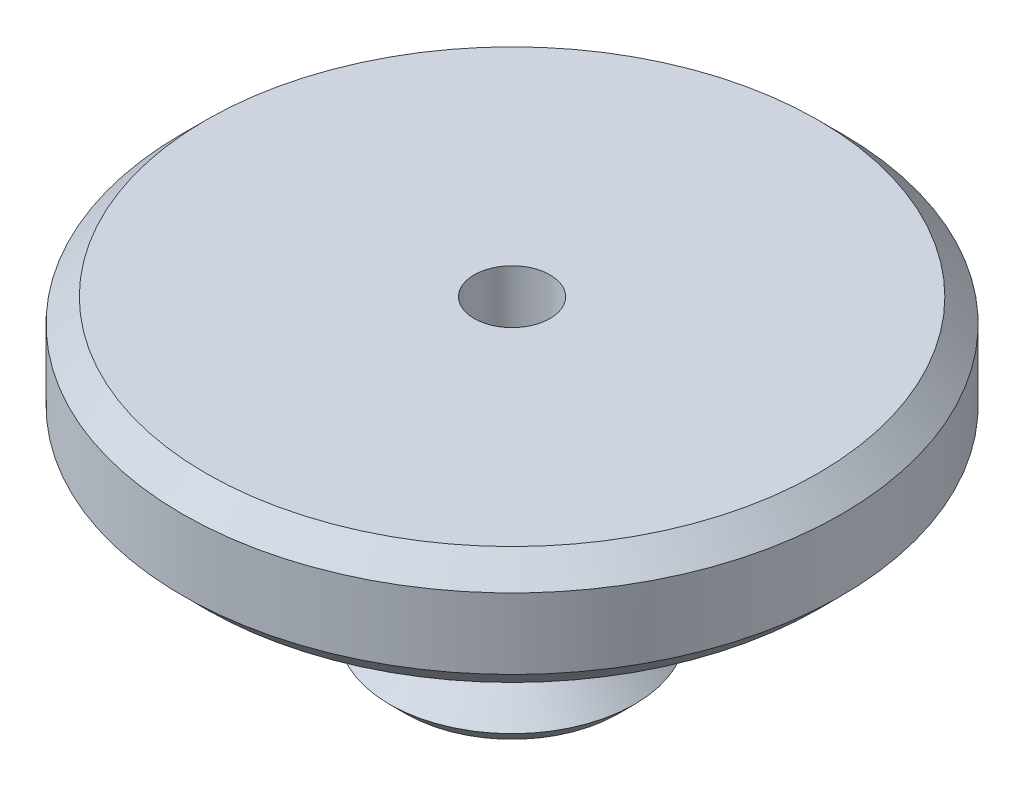
ISO-10303-21;
HEADER;
FILE_DESCRIPTION(('STEP AP214'),'2;1');
FILE_NAME('part.step','',(''),(''),'','','');
FILE_SCHEMA(('AUTOMOTIVE_DESIGN { 1 0 10303 214 1 1 1 1 }'));
ENDSEC;
DATA;
#1=APPLICATION_CONTEXT('core data for automotive mechanical design processes');
#2=APPLICATION_PROTOCOL_DEFINITION('international standard','automotive_design',2000,#1);
#3=PRODUCT_CONTEXT('',#1,'mechanical');
#4=PRODUCT('Part','Part','',(#3));
#5=PRODUCT_RELATED_PRODUCT_CATEGORY('part','',(#4));
#6=PRODUCT_DEFINITION_FORMATION('','',#4);
#7=PRODUCT_DEFINITION_CONTEXT('part definition',#1,'design');
#8=PRODUCT_DEFINITION('design','',#6,#7);
#9=PRODUCT_DEFINITION_SHAPE('','',#8);
#10=(LENGTH_UNIT() NAMED_UNIT(*) SI_UNIT(.MILLI.,.METRE.));
#11=(NAMED_UNIT(*) PLANE_ANGLE_UNIT() SI_UNIT($,.RADIAN.));
#12=(NAMED_UNIT(*) SI_UNIT($,.STERADIAN.) SOLID_ANGLE_UNIT());
#13=UNCERTAINTY_MEASURE_WITH_UNIT(LENGTH_MEASURE(1.E-05),#10,'distance_accuracy_value','');
#14=(GEOMETRIC_REPRESENTATION_CONTEXT(3) GLOBAL_UNCERTAINTY_ASSIGNED_CONTEXT((#13)) GLOBAL_UNIT_ASSIGNED_CONTEXT((#10,
#11,#12)) REPRESENTATION_CONTEXT('',''));
#15=CARTESIAN_POINT('',(0.,0.,0.));
#16=DIRECTION('',(0.,0.,1.));
#17=DIRECTION('',(1.,0.,0.));
#18=AXIS2_PLACEMENT_3D('',#15,#16,#17);
#19=CARTESIAN_POINT('',(0.,0.,0.));
#20=DIRECTION('',(0.,1.,0.));
#21=DIRECTION('',(0.,0.,1.));
#22=AXIS2_PLACEMENT_3D('',#19,#20,#21);
#23=PLANE('',#22);
#24=CARTESIAN_POINT('',(0.,0.,0.));
#25=DIRECTION('',(0.,1.,0.));
#26=DIRECTION('',(0.,0.,1.));
#27=AXIS2_PLACEMENT_3D('',#24,#25,#26);
#28=CIRCLE('',#27,13.);
#29=CARTESIAN_POINT('',(0.,0.,13.));
#30=VERTEX_POINT('',#29);
#31=EDGE_CURVE('E10',#30,#30,#28,.T.);
#32=ORIENTED_EDGE('',*,*,#31,.T.);
#33=EDGE_LOOP('',(#32));
#34=FACE_BOUND('',#33,.T.);
#35=CARTESIAN_POINT('',(0.,0.,0.));
#36=DIRECTION('',(0.,1.,0.));
#37=DIRECTION('',(0.,0.,1.));
#38=AXIS2_PLACEMENT_3D('',#35,#36,#37);
#39=CIRCLE('',#38,1.61);
#40=CARTESIAN_POINT('',(0.,0.,1.61));
#41=VERTEX_POINT('',#40);
#42=EDGE_CURVE('E84',#41,#41,#39,.T.);
#43=ORIENTED_EDGE('',*,*,#42,.F.);
#44=EDGE_LOOP('',(#43));
#45=FACE_BOUND('',#44,.T.);
#46=ADVANCED_FACE('F34',(#34,#45),#23,.T.);
#47=CARTESIAN_POINT('',(0.,-10.,0.));
#48=DIRECTION('',(0.,-1.,0.));
#49=DIRECTION('',(0.,0.,-1.));
#50=AXIS2_PLACEMENT_3D('',#47,#48,#49);
#51=CYLINDRICAL_SURFACE('',#50,14.);
#52=CARTESIAN_POINT('',(0.,-4.00000000000001,0.));
#53=DIRECTION('',(0.,-1.,0.));
#54=DIRECTION('',(0.,0.,-1.));
#55=AXIS2_PLACEMENT_3D('',#52,#53,#54);
#56=CIRCLE('',#55,14.);
#57=CARTESIAN_POINT('',(0.,-4.00000000000001,-14.));
#58=VERTEX_POINT('',#57);
#59=EDGE_CURVE('E41',#58,#58,#56,.F.);
#60=ORIENTED_EDGE('',*,*,#59,.T.);
#61=EDGE_LOOP('',(#60));
#62=FACE_BOUND('',#61,.T.);
#63=CARTESIAN_POINT('',(0.,-0.999999999999994,0.));
#64=DIRECTION('',(0.,1.,0.));
#65=DIRECTION('',(0.,0.,1.));
#66=AXIS2_PLACEMENT_3D('',#63,#64,#65);
#67=CIRCLE('',#66,14.);
#68=CARTESIAN_POINT('',(0.,-0.999999999999994,14.));
#69=VERTEX_POINT('',#68);
#70=EDGE_CURVE('E45',#69,#69,#67,.F.);
#71=ORIENTED_EDGE('',*,*,#70,.T.);
#72=EDGE_LOOP('',(#71));
#73=FACE_BOUND('',#72,.T.);
#74=ADVANCED_FACE('F91',(#62,#73),#51,.T.);
#75=CARTESIAN_POINT('',(14.,-5.,0.));
#76=DIRECTION('',(0.,-1.,0.));
#77=DIRECTION('',(0.,0.,-1.));
#78=AXIS2_PLACEMENT_3D('',#75,#76,#77);
#79=PLANE('',#78);
#80=CARTESIAN_POINT('',(0.,-5.,0.));
#81=DIRECTION('',(0.,-1.,0.));
#82=DIRECTION('',(0.,0.,-1.));
#83=AXIS2_PLACEMENT_3D('',#80,#81,#82);
#84=CIRCLE('',#83,13.);
#85=CARTESIAN_POINT('',(0.,-5.,-13.));
#86=VERTEX_POINT('',#85);
#87=EDGE_CURVE('E49',#86,#86,#84,.T.);
#88=ORIENTED_EDGE('',*,*,#87,.T.);
#89=EDGE_LOOP('',(#88));
#90=FACE_BOUND('',#89,.T.);
#91=CARTESIAN_POINT('',(0.,-5.,0.));
#92=DIRECTION('',(0.,-1.,0.));
#93=DIRECTION('',(0.,0.,-1.));
#94=AXIS2_PLACEMENT_3D('',#91,#92,#93);
#95=CIRCLE('',#94,5.);
#96=CARTESIAN_POINT('',(0.,-5.,-5.00000000000001));
#97=VERTEX_POINT('',#96);
#98=EDGE_CURVE('E60',#97,#97,#95,.T.);
#99=ORIENTED_EDGE('',*,*,#98,.F.);
#100=EDGE_LOOP('',(#99));
#101=FACE_BOUND('',#100,.T.);
#102=ADVANCED_FACE('F96',(#90,#101),#79,.T.);
#103=CARTESIAN_POINT('',(0.,-10.,0.));
#104=DIRECTION('',(0.,-1.,0.));
#105=DIRECTION('',(0.,0.,-1.));
#106=AXIS2_PLACEMENT_3D('',#103,#104,#105);
#107=CYLINDRICAL_SURFACE('',#106,5.);
#108=ORIENTED_EDGE('',*,*,#98,.T.);
#109=EDGE_LOOP('',(#108));
#110=FACE_BOUND('',#109,.T.);
#111=CARTESIAN_POINT('',(0.,-10.,0.));
#112=DIRECTION('',(0.,-1.,0.));
#113=DIRECTION('',(0.,0.,-1.));
#114=AXIS2_PLACEMENT_3D('',#111,#112,#113);
#115=CIRCLE('',#114,5.);
#116=CARTESIAN_POINT('',(0.,-10.,-5.00000000000001));
#117=VERTEX_POINT('',#116);
#118=EDGE_CURVE('E63',#117,#117,#115,.T.);
#119=ORIENTED_EDGE('',*,*,#118,.F.);
#120=EDGE_LOOP('',(#119));
#121=FACE_BOUND('',#120,.T.);
#122=ADVANCED_FACE('F115',(#110,#121),#107,.T.);
#123=CARTESIAN_POINT('',(5.00000000000001,-10.,0.));
#124=DIRECTION('',(0.,-1.,0.));
#125=DIRECTION('',(0.,0.,-1.));
#126=AXIS2_PLACEMENT_3D('',#123,#124,#125);
#127=PLANE('',#126);
#128=ORIENTED_EDGE('',*,*,#118,.T.);
#129=EDGE_LOOP('',(#128));
#130=FACE_BOUND('',#129,.T.);
#131=CARTESIAN_POINT('',(0.,-10.,0.));
#132=DIRECTION('',(0.,-1.,0.));
#133=DIRECTION('',(0.,0.,-1.));
#134=AXIS2_PLACEMENT_3D('',#131,#132,#133);
#135=CIRCLE('',#134,4.);
#136=CARTESIAN_POINT('',(0.,-10.,-4.00000000000001));
#137=VERTEX_POINT('',#136);
#138=EDGE_CURVE('E66',#137,#137,#135,.T.);
#139=ORIENTED_EDGE('',*,*,#138,.F.);
#140=EDGE_LOOP('',(#139));
#141=FACE_BOUND('',#140,.T.);
#142=ADVANCED_FACE('F120',(#130,#141),#127,.T.);
#143=CARTESIAN_POINT('',(0.,-10.,0.));
#144=DIRECTION('',(0.,-1.,0.));
#145=DIRECTION('',(0.,0.,-1.));
#146=AXIS2_PLACEMENT_3D('',#143,#144,#145);
#147=CYLINDRICAL_SURFACE('',#146,4.);
#148=ORIENTED_EDGE('',*,*,#138,.T.);
#149=EDGE_LOOP('',(#148));
#150=FACE_BOUND('',#149,.T.);
#151=CARTESIAN_POINT('',(0.,-11.2,0.));
#152=DIRECTION('',(0.,-1.,0.));
#153=DIRECTION('',(0.,0.,-1.));
#154=AXIS2_PLACEMENT_3D('',#151,#152,#153);
#155=CIRCLE('',#154,4.);
#156=CARTESIAN_POINT('',(0.,-11.2,-4.00000000000001));
#157=VERTEX_POINT('',#156);
#158=EDGE_CURVE('E69',#157,#157,#155,.T.);
#159=ORIENTED_EDGE('',*,*,#158,.F.);
#160=EDGE_LOOP('',(#159));
#161=FACE_BOUND('',#160,.T.);
#162=ADVANCED_FACE('F126',(#150,#161),#147,.T.);
#163=CARTESIAN_POINT('',(0.,-12.4,0.));
#164=DIRECTION('',(0.,-1.,0.));
#165=DIRECTION('',(0.,0.,-1.));
#166=AXIS2_PLACEMENT_3D('',#163,#164,#165);
#167=CONICAL_SURFACE('',#166,5.20000000000001,0.785398163397451);
#168=ORIENTED_EDGE('',*,*,#158,.T.);
#169=EDGE_LOOP('',(#168));
#170=FACE_BOUND('',#169,.T.);
#171=CARTESIAN_POINT('',(0.,-12.4,0.));
#172=DIRECTION('',(0.,-1.,0.));
#173=DIRECTION('',(0.,0.,-1.));
#174=AXIS2_PLACEMENT_3D('',#171,#172,#173);
#175=CIRCLE('',#174,5.20000000000001);
#176=CARTESIAN_POINT('',(0.,-12.4,-5.20000000000002));
#177=VERTEX_POINT('',#176);
#178=EDGE_CURVE('E72',#177,#177,#175,.T.);
#179=ORIENTED_EDGE('',*,*,#178,.F.);
#180=EDGE_LOOP('',(#179));
#181=FACE_BOUND('',#180,.T.);
#182=ADVANCED_FACE('F132',(#170,#181),#167,.T.);
#183=CARTESIAN_POINT('',(0.,-13.1071067811865,0.));
#184=DIRECTION('',(0.,1.,0.));
#185=DIRECTION('',(0.,0.,1.));
#186=AXIS2_PLACEMENT_3D('',#183,#184,#185);
#187=CONICAL_SURFACE('',#186,4.49289321881346,0.785398163397447);
#188=ORIENTED_EDGE('',*,*,#178,.T.);
#189=EDGE_LOOP('',(#188));
#190=FACE_BOUND('',#189,.T.);
#191=CARTESIAN_POINT('',(0.,-13.1071067811865,0.));
#192=DIRECTION('',(0.,-1.,0.));
#193=DIRECTION('',(0.,0.,-1.));
#194=AXIS2_PLACEMENT_3D('',#191,#192,#193);
#195=CIRCLE('',#194,4.49289321881346);
#196=CARTESIAN_POINT('',(0.,-13.1071067811865,-4.49289321881347));
#197=VERTEX_POINT('',#196);
#198=EDGE_CURVE('E75',#197,#197,#195,.T.);
#199=ORIENTED_EDGE('',*,*,#198,.F.);
#200=EDGE_LOOP('',(#199));
#201=FACE_BOUND('',#200,.T.);
#202=ADVANCED_FACE('F138',(#190,#201),#187,.T.);
#203=CARTESIAN_POINT('',(0.,-11.2,0.));
#204=DIRECTION('',(0.,-1.,0.));
#205=DIRECTION('',(0.,0.,-1.));
#206=AXIS2_PLACEMENT_3D('',#203,#204,#205);
#207=CONICAL_SURFACE('',#206,2.5857864376269,0.78539816339745);
#208=ORIENTED_EDGE('',*,*,#198,.T.);
#209=EDGE_LOOP('',(#208));
#210=FACE_BOUND('',#209,.T.);
#211=CARTESIAN_POINT('',(0.,-11.2,0.));
#212=DIRECTION('',(0.,-1.,0.));
#213=DIRECTION('',(0.,0.,-1.));
#214=AXIS2_PLACEMENT_3D('',#211,#212,#213);
#215=CIRCLE('',#214,2.5857864376269);
#216=CARTESIAN_POINT('',(0.,-11.2,-2.58578643762691));
#217=VERTEX_POINT('',#216);
#218=EDGE_CURVE('E78',#217,#217,#215,.T.);
#219=ORIENTED_EDGE('',*,*,#218,.F.);
#220=EDGE_LOOP('',(#219));
#221=FACE_BOUND('',#220,.T.);
#222=ADVANCED_FACE('F144',(#210,#221),#207,.F.);
#223=CARTESIAN_POINT('',(0.,-10.,0.));
#224=DIRECTION('',(0.,-1.,0.));
#225=DIRECTION('',(0.,0.,-1.));
#226=AXIS2_PLACEMENT_3D('',#223,#224,#225);
#227=CYLINDRICAL_SURFACE('',#226,2.5857864376269);
#228=ORIENTED_EDGE('',*,*,#218,.T.);
#229=EDGE_LOOP('',(#228));
#230=FACE_BOUND('',#229,.T.);
#231=CARTESIAN_POINT('',(0.,-10.,0.));
#232=DIRECTION('',(0.,-1.,0.));
#233=DIRECTION('',(0.,0.,-1.));
#234=AXIS2_PLACEMENT_3D('',#231,#232,#233);
#235=CIRCLE('',#234,2.5857864376269);
#236=CARTESIAN_POINT('',(0.,-10.,-2.58578643762691));
#237=VERTEX_POINT('',#236);
#238=EDGE_CURVE('E81',#237,#237,#235,.T.);
#239=ORIENTED_EDGE('',*,*,#238,.F.);
#240=EDGE_LOOP('',(#239));
#241=FACE_BOUND('',#240,.T.);
#242=ADVANCED_FACE('F150',(#230,#241),#227,.F.);
#243=CARTESIAN_POINT('',(2.58578643762691,-10.,0.));
#244=DIRECTION('',(0.,-1.,0.));
#245=DIRECTION('',(0.,0.,-1.));
#246=AXIS2_PLACEMENT_3D('',#243,#244,#245);
#247=PLANE('',#246);
#248=CARTESIAN_POINT('',(0.,-10.,0.));
#249=DIRECTION('',(0.,-1.,0.));
#250=DIRECTION('',(0.,0.,-1.));
#251=AXIS2_PLACEMENT_3D('',#248,#249,#250);
#252=CIRCLE('',#251,2.00000000000003);
#253=CARTESIAN_POINT('',(0.,-10.,-2.00000000000004));
#254=VERTEX_POINT('',#253);
#255=EDGE_CURVE('E54',#254,#254,#252,.F.);
#256=ORIENTED_EDGE('',*,*,#255,.T.);
#257=EDGE_LOOP('',(#256));
#258=FACE_BOUND('',#257,.T.);
#259=ORIENTED_EDGE('',*,*,#238,.T.);
#260=EDGE_LOOP('',(#259));
#261=FACE_BOUND('',#260,.T.);
#262=ADVANCED_FACE('F156',(#258,#261),#247,.T.);
#263=CARTESIAN_POINT('',(0.,-13.1071067811865,0.));
#264=DIRECTION('',(0.,1.,0.));
#265=DIRECTION('',(0.,0.,1.));
#266=AXIS2_PLACEMENT_3D('',#263,#264,#265);
#267=CYLINDRICAL_SURFACE('',#266,1.61);
#268=CARTESIAN_POINT('',(0.,-9.60999999999997,0.));
#269=DIRECTION('',(0.,-1.,0.));
#270=DIRECTION('',(0.,0.,-1.));
#271=AXIS2_PLACEMENT_3D('',#268,#269,#270);
#272=CIRCLE('',#271,1.61);
#273=CARTESIAN_POINT('',(0.,-9.60999999999997,1.61));
#274=VERTEX_POINT('',#273);
#275=EDGE_CURVE('E57',#274,#274,#272,.T.);
#276=CARTESIAN_POINT('',(0.,-9.60999999999997,1.61));
#277=CARTESIAN_POINT('',(0.,-9.5098958333333,1.61));
#278=CARTESIAN_POINT('',(0.,-9.40979166666664,1.61));
#279=CARTESIAN_POINT('',(0.,-9.20958333333331,1.61));
#280=CARTESIAN_POINT('',(0.,-9.10947916666664,1.61));
#281=CARTESIAN_POINT('',(0.,-8.90927083333331,1.61));
#282=CARTESIAN_POINT('',(0.,-8.80916666666664,1.61));
#283=CARTESIAN_POINT('',(0.,-8.60895833333331,1.61));
#284=CARTESIAN_POINT('',(0.,-8.50885416666664,1.61));
#285=CARTESIAN_POINT('',(0.,-8.30864583333331,1.61));
#286=CARTESIAN_POINT('',(0.,-8.20854166666664,1.61));
#287=CARTESIAN_POINT('',(0.,-8.00833333333331,1.61));
#288=CARTESIAN_POINT('',(0.,-7.90822916666664,1.61));
#289=CARTESIAN_POINT('',(0.,-7.70802083333331,1.61));
#290=CARTESIAN_POINT('',(0.,-7.60791666666664,1.61));
#291=CARTESIAN_POINT('',(0.,-7.40770833333331,1.61));
#292=CARTESIAN_POINT('',(0.,-7.30760416666664,1.61));
#293=CARTESIAN_POINT('',(0.,-7.10739583333331,1.61));
#294=CARTESIAN_POINT('',(0.,-7.00729166666664,1.61));
#295=CARTESIAN_POINT('',(0.,-6.80708333333331,1.61));
#296=CARTESIAN_POINT('',(0.,-6.70697916666665,1.61));
#297=CARTESIAN_POINT('',(0.,-6.50677083333331,1.61));
#298=CARTESIAN_POINT('',(0.,-6.40666666666665,1.61));
#299=CARTESIAN_POINT('',(0.,-6.20645833333331,1.61));
#300=CARTESIAN_POINT('',(0.,-6.10635416666665,1.61));
#301=CARTESIAN_POINT('',(0.,-5.90614583333332,1.61));
#302=CARTESIAN_POINT('',(0.,-5.80604166666665,1.61));
#303=CARTESIAN_POINT('',(0.,-5.60583333333332,1.61));
#304=CARTESIAN_POINT('',(0.,-5.50572916666665,1.61));
#305=CARTESIAN_POINT('',(0.,-5.30552083333332,1.61));
#306=CARTESIAN_POINT('',(0.,-5.20541666666665,1.61));
#307=CARTESIAN_POINT('',(0.,-5.00520833333332,1.61));
#308=CARTESIAN_POINT('',(0.,-4.90510416666665,1.61));
#309=CARTESIAN_POINT('',(0.,-4.70489583333332,1.61));
#310=CARTESIAN_POINT('',(0.,-4.60479166666665,1.61));
#311=CARTESIAN_POINT('',(0.,-4.40458333333332,1.61));
#312=CARTESIAN_POINT('',(0.,-4.30447916666665,1.61));
#313=CARTESIAN_POINT('',(0.,-4.10427083333332,1.61));
#314=CARTESIAN_POINT('',(0.,-4.00416666666665,1.61));
#315=CARTESIAN_POINT('',(0.,-3.80395833333332,1.61));
#316=CARTESIAN_POINT('',(0.,-3.70385416666666,1.61));
#317=CARTESIAN_POINT('',(0.,-3.50364583333332,1.61));
#318=CARTESIAN_POINT('',(0.,-3.40354166666666,1.61));
#319=CARTESIAN_POINT('',(0.,-3.20333333333332,1.61));
#320=CARTESIAN_POINT('',(0.,-3.10322916666666,1.61));
#321=CARTESIAN_POINT('',(0.,-2.90302083333332,1.61));
#322=CARTESIAN_POINT('',(0.,-2.80291666666666,1.61));
#323=CARTESIAN_POINT('',(0.,-2.60270833333332,1.61));
#324=CARTESIAN_POINT('',(0.,-2.50260416666666,1.61));
#325=CARTESIAN_POINT('',(0.,-2.30239583333333,1.61));
#326=CARTESIAN_POINT('',(0.,-2.20229166666666,1.61));
#327=CARTESIAN_POINT('',(0.,-2.00208333333333,1.61));
#328=CARTESIAN_POINT('',(0.,-1.90197916666666,1.61));
#329=CARTESIAN_POINT('',(0.,-1.70177083333333,1.61));
#330=CARTESIAN_POINT('',(0.,-1.60166666666666,1.61));
#331=CARTESIAN_POINT('',(0.,-1.40145833333333,1.61));
#332=CARTESIAN_POINT('',(0.,-1.30135416666666,1.61));
#333=CARTESIAN_POINT('',(0.,-1.10114583333333,1.61));
#334=CARTESIAN_POINT('',(0.,-1.00104166666666,1.61));
#335=CARTESIAN_POINT('',(0.,-0.800833333333329,1.61));
#336=CARTESIAN_POINT('',(0.,-0.700729166666663,1.61));
#337=CARTESIAN_POINT('',(0.,-0.50052083333333,1.61));
#338=CARTESIAN_POINT('',(0.,-0.400416666666664,1.61));
#339=CARTESIAN_POINT('',(0.,-0.200208333333331,1.61));
#340=CARTESIAN_POINT('',(0.,-0.100104166666664,1.61));
#341=CARTESIAN_POINT('',(0.,0.,1.61));
#342=B_SPLINE_CURVE_WITH_KNOTS('',3,(#276,#277,#278,#279,#280,#281,#282,#283,#284,#285,#286,
#287,#288,#289,#290,#291,#292,#293,#294,#295,#296,#297,#298,#299,#300,#301,#302,#303,#304,#305,
#306,#307,#308,#309,#310,#311,#312,#313,#314,#315,#316,#317,#318,#319,#320,#321,#322,#323,#324,
#325,#326,#327,#328,#329,#330,#331,#332,#333,#334,#335,#336,#337,#338,#339,#340,#341),
.UNSPECIFIED.,.F.,.F.,(4,2,2,2,2,2,2,2,2,2,2,2,2,2,2,2,2,2,2,2,2,2,2,2,2,2,2,2,2,2,2,2,4),(0.,
0.300312499999998,0.600624999999999,0.900937499999996,1.20125,1.5015625,1.80187499999999,
2.10218749999999,2.40249999999999,2.70281249999999,3.00312499999999,3.30343749999999,
3.60374999999999,3.90406249999999,4.20437499999999,4.50468749999999,4.80499999999999,
5.10531249999999,5.40562499999998,5.70593749999998,6.00624999999998,6.30656249999998,
6.60687499999998,6.90718749999998,7.20749999999998,7.50781249999998,7.80812499999998,
8.10843749999998,8.40874999999997,8.70906249999998,9.00937499999997,9.30968749999997,
9.60999999999997),.UNSPECIFIED.);
#343=EDGE_CURVE('BSEAM88',#274,#41,#342,.T.);
#344=ORIENTED_EDGE('',*,*,#275,.T.);
#345=ORIENTED_EDGE('',*,*,#42,.T.);
#346=ORIENTED_EDGE('',*,*,#343,.T.);
#347=ORIENTED_EDGE('',*,*,#343,.F.);
#348=EDGE_LOOP('',(#344,#346,#345,#347));
#349=FACE_BOUND('',#348,.T.);
#350=ADVANCED_FACE('F88',(#349),#267,.F.);
#351=CARTESIAN_POINT('',(0.,-9.60999999999997,0.));
#352=DIRECTION('',(0.,-1.,0.));
#353=DIRECTION('',(0.,0.,-1.));
#354=AXIS2_PLACEMENT_3D('',#351,#352,#353);
#355=CONICAL_SURFACE('',#354,1.61,0.78539816339745);
#356=ORIENTED_EDGE('',*,*,#255,.F.);
#357=EDGE_LOOP('',(#356));
#358=FACE_BOUND('',#357,.T.);
#359=ORIENTED_EDGE('',*,*,#275,.F.);
#360=EDGE_LOOP('',(#359));
#361=FACE_BOUND('',#360,.T.);
#362=ADVANCED_FACE('F100',(#358,#361),#355,.F.);
#363=CARTESIAN_POINT('',(0.,-5.,0.));
#364=DIRECTION('',(0.,1.,0.));
#365=DIRECTION('',(0.,0.,1.));
#366=AXIS2_PLACEMENT_3D('',#363,#364,#365);
#367=CONICAL_SURFACE('',#366,13.,0.785398163397448);
#368=ORIENTED_EDGE('',*,*,#59,.F.);
#369=EDGE_LOOP('',(#368));
#370=FACE_BOUND('',#369,.T.);
#371=ORIENTED_EDGE('',*,*,#87,.F.);
#372=EDGE_LOOP('',(#371));
#373=FACE_BOUND('',#372,.T.);
#374=ADVANCED_FACE('F102',(#370,#373),#367,.T.);
#375=CARTESIAN_POINT('',(0.,-0.999999999999994,0.));
#376=DIRECTION('',(0.,-1.,0.));
#377=DIRECTION('',(0.,0.,-1.));
#378=AXIS2_PLACEMENT_3D('',#375,#376,#377);
#379=CONICAL_SURFACE('',#378,14.,0.78539816339745);
#380=ORIENTED_EDGE('',*,*,#31,.F.);
#381=EDGE_LOOP('',(#380));
#382=FACE_BOUND('',#381,.T.);
#383=ORIENTED_EDGE('',*,*,#70,.F.);
#384=EDGE_LOOP('',(#383));
#385=FACE_BOUND('',#384,.T.);
#386=ADVANCED_FACE('F36',(#382,#385),#379,.T.);
#387=CLOSED_SHELL('',(#46,#74,#102,#122,#142,#162,#182,#202,#222,#242,#262,#350,#362,#374,#386));
#388=MANIFOLD_SOLID_BREP('B2',#387);
#389=ADVANCED_BREP_SHAPE_REPRESENTATION('',(#18,#388),#14);
#390=SHAPE_DEFINITION_REPRESENTATION(#9,#389);
ENDSEC;
END-ISO-10303-21;
